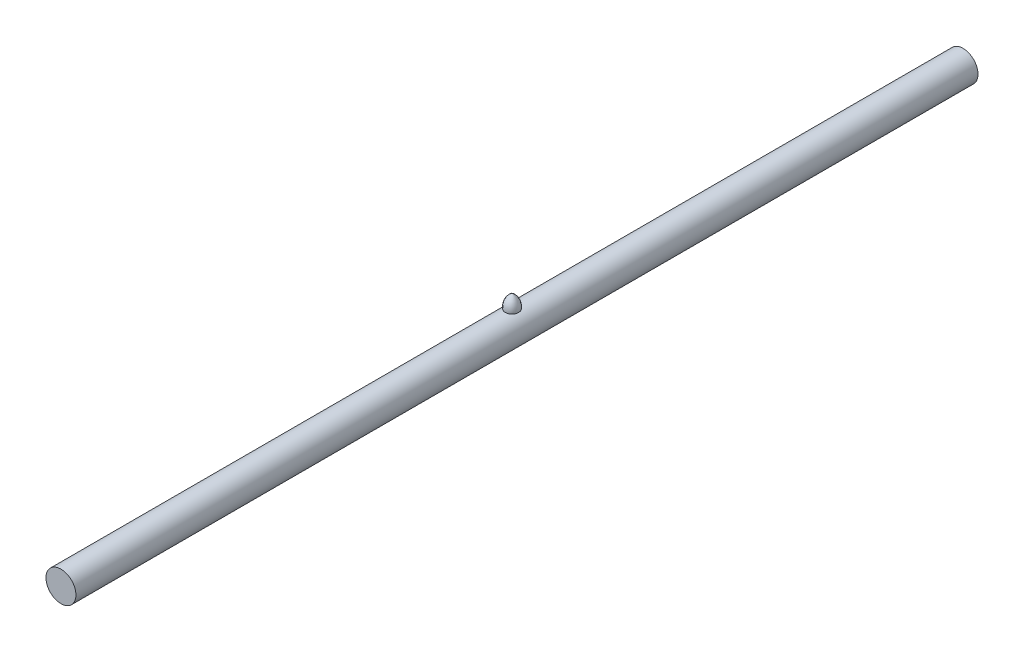
ISO-10303-21;
HEADER;
FILE_DESCRIPTION(('STEP AP214'),'2;1');
FILE_NAME('part.step','',(''),(''),'','','');
FILE_SCHEMA(('AUTOMOTIVE_DESIGN { 1 0 10303 214 1 1 1 1 }'));
ENDSEC;
DATA;
#1=APPLICATION_CONTEXT('core data for automotive mechanical design processes');
#2=APPLICATION_PROTOCOL_DEFINITION('international standard','automotive_design',2000,#1);
#3=PRODUCT_CONTEXT('',#1,'mechanical');
#4=PRODUCT('Part','Part','',(#3));
#5=PRODUCT_RELATED_PRODUCT_CATEGORY('part','',(#4));
#6=PRODUCT_DEFINITION_FORMATION('','',#4);
#7=PRODUCT_DEFINITION_CONTEXT('part definition',#1,'design');
#8=PRODUCT_DEFINITION('design','',#6,#7);
#9=PRODUCT_DEFINITION_SHAPE('','',#8);
#10=(LENGTH_UNIT() NAMED_UNIT(*) SI_UNIT(.MILLI.,.METRE.));
#11=(NAMED_UNIT(*) PLANE_ANGLE_UNIT() SI_UNIT($,.RADIAN.));
#12=(NAMED_UNIT(*) SI_UNIT($,.STERADIAN.) SOLID_ANGLE_UNIT());
#13=UNCERTAINTY_MEASURE_WITH_UNIT(LENGTH_MEASURE(1.E-05),#10,'distance_accuracy_value','');
#14=(GEOMETRIC_REPRESENTATION_CONTEXT(3) GLOBAL_UNCERTAINTY_ASSIGNED_CONTEXT((#13)) GLOBAL_UNIT_ASSIGNED_CONTEXT((#10,
#11,#12)) REPRESENTATION_CONTEXT('',''));
#15=CARTESIAN_POINT('',(0.,0.,0.));
#16=DIRECTION('',(0.,0.,1.));
#17=DIRECTION('',(1.,0.,0.));
#18=AXIS2_PLACEMENT_3D('',#15,#16,#17);
#19=CARTESIAN_POINT('',(0.,2.85749999999999,84.7725));
#20=DIRECTION('',(0.,1.,0.));
#21=DIRECTION('',(0.,0.,1.));
#22=AXIS2_PLACEMENT_3D('',#19,#20,#21);
#23=PLANE('',#22);
#24=CARTESIAN_POINT('',(0.,2.85749999999999,86.0425));
#25=DIRECTION('',(0.,1.,0.));
#26=DIRECTION('',(0.,0.,1.));
#27=AXIS2_PLACEMENT_3D('',#24,#25,#26);
#28=CIRCLE('',#27,1.26999999999999);
#29=CARTESIAN_POINT('',(0.,2.85749999999999,87.3125));
#30=VERTEX_POINT('',#29);
#31=EDGE_CURVE('E12',#30,#30,#28,.T.);
#32=ORIENTED_EDGE('',*,*,#31,.F.);
#33=EDGE_LOOP('',(#32));
#34=FACE_BOUND('',#33,.T.);
#35=ADVANCED_FACE('F41',(#34),#23,.F.);
#36=CARTESIAN_POINT('',(0.,3.18564279213885,84.7937855842777));
#37=DIRECTION('',(-1.,0.,0.));
#38=DIRECTION('',(0.,0.,1.));
#39=AXIS2_PLACEMENT_3D('',#36,#37,#38);
#40=CIRCLE('',#39,2.54);
#41=TRIMMED_CURVE('',#40,(PARAMETER_VALUE(-1.05684738515043)),
(PARAMETER_VALUE(1.05684738515043)),.T.,.PARAMETER.);
#42=CARTESIAN_POINT('',(0.,3.18564279213885,86.0425));
#43=DIRECTION('',(0.,1.,0.));
#44=AXIS1_PLACEMENT('',#42,#43);
#45=SURFACE_OF_REVOLUTION('',#41,#44);
#46=CARTESIAN_POINT('',(0.,5.3975,86.0425));
#47=VERTEX_POINT('',#46);
#48=VERTEX_LOOP('',#47);
#49=FACE_BOUND('',#48,.T.);
#50=ORIENTED_EDGE('',*,*,#31,.T.);
#51=EDGE_LOOP('',(#50));
#52=FACE_BOUND('',#51,.T.);
#53=ADVANCED_FACE('F48',(#49,#52),#45,.T.);
#54=CLOSED_SHELL('',(#35,#53));
#55=MANIFOLD_SOLID_BREP('B2',#54);
#56=CARTESIAN_POINT('',(0.,0.,172.085));
#57=DIRECTION('',(0.,0.,-1.));
#58=DIRECTION('',(-1.,0.,0.));
#59=AXIS2_PLACEMENT_3D('',#56,#57,#58);
#60=CYLINDRICAL_SURFACE('',#59,2.8575);
#61=CARTESIAN_POINT('',(0.,0.,172.085));
#62=DIRECTION('',(0.,0.,1.));
#63=DIRECTION('',(1.,0.,0.));
#64=AXIS2_PLACEMENT_3D('',#61,#62,#63);
#65=CIRCLE('',#64,2.8575);
#66=CARTESIAN_POINT('',(2.8575,0.,172.085));
#67=VERTEX_POINT('',#66);
#68=EDGE_CURVE('E40',#67,#67,#65,.T.);
#69=ORIENTED_EDGE('',*,*,#68,.F.);
#70=EDGE_LOOP('',(#69));
#71=FACE_BOUND('',#70,.T.);
#72=CARTESIAN_POINT('',(0.,0.,0.));
#73=DIRECTION('',(0.,0.,1.));
#74=DIRECTION('',(1.,0.,0.));
#75=AXIS2_PLACEMENT_3D('',#72,#73,#74);
#76=CIRCLE('',#75,2.8575);
#77=CARTESIAN_POINT('',(2.8575,0.,0.));
#78=VERTEX_POINT('',#77);
#79=EDGE_CURVE('E72',#78,#78,#76,.T.);
#80=ORIENTED_EDGE('',*,*,#79,.T.);
#81=EDGE_LOOP('',(#80));
#82=FACE_BOUND('',#81,.T.);
#83=ADVANCED_FACE('F69',(#71,#82),#60,.T.);
#84=CARTESIAN_POINT('',(0.,0.,172.085));
#85=DIRECTION('',(0.,0.,1.));
#86=DIRECTION('',(1.,0.,0.));
#87=AXIS2_PLACEMENT_3D('',#84,#85,#86);
#88=PLANE('',#87);
#89=ORIENTED_EDGE('',*,*,#68,.T.);
#90=EDGE_LOOP('',(#89));
#91=FACE_BOUND('',#90,.T.);
#92=ADVANCED_FACE('F84',(#91),#88,.T.);
#93=CARTESIAN_POINT('',(0.,0.,0.));
#94=DIRECTION('',(0.,0.,1.));
#95=DIRECTION('',(1.,0.,0.));
#96=AXIS2_PLACEMENT_3D('',#93,#94,#95);
#97=PLANE('',#96);
#98=ORIENTED_EDGE('',*,*,#79,.F.);
#99=EDGE_LOOP('',(#98));
#100=FACE_BOUND('',#99,.T.);
#101=ADVANCED_FACE('F82',(#100),#97,.F.);
#102=CLOSED_SHELL('',(#83,#92,#101));
#103=MANIFOLD_SOLID_BREP('B6',#102);
#104=ADVANCED_BREP_SHAPE_REPRESENTATION('',(#18,#55,#103),#14);
#105=SHAPE_DEFINITION_REPRESENTATION(#9,#104);
ENDSEC;
END-ISO-10303-21;
